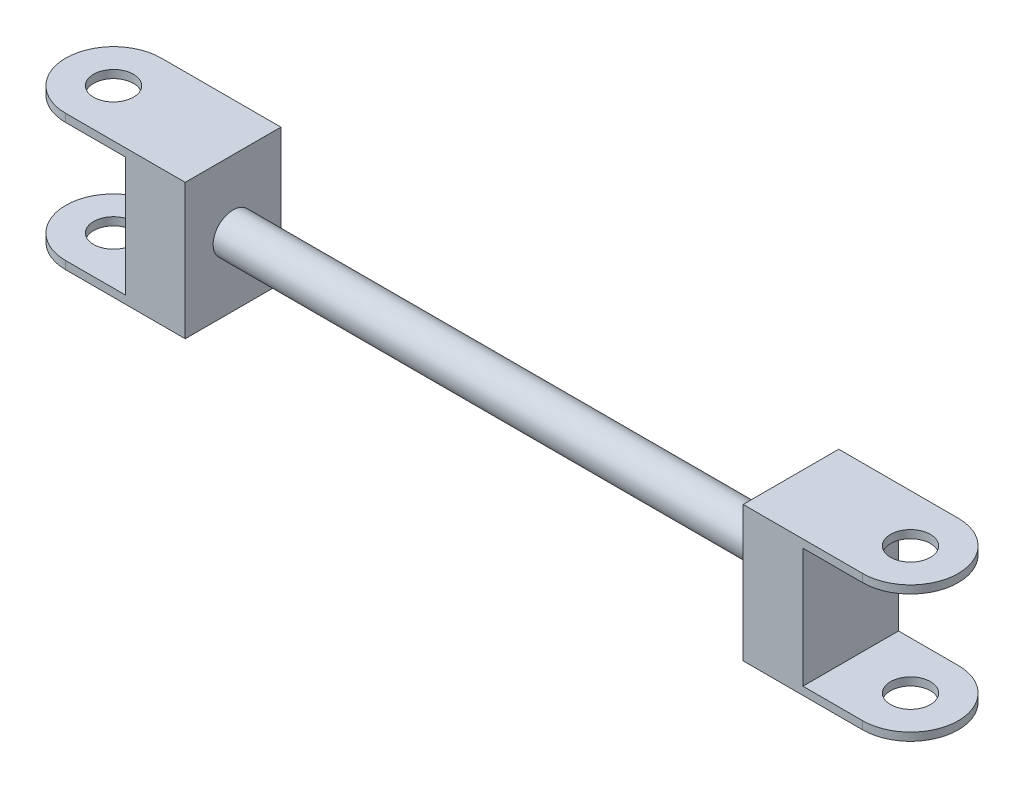
ISO-10303-21;
HEADER;
FILE_DESCRIPTION(('STEP AP214'),'2;1');
FILE_NAME('part.step','',(''),(''),'','','');
FILE_SCHEMA(('AUTOMOTIVE_DESIGN { 1 0 10303 214 1 1 1 1 }'));
ENDSEC;
DATA;
#1=APPLICATION_CONTEXT('core data for automotive mechanical design processes');
#2=APPLICATION_PROTOCOL_DEFINITION('international standard','automotive_design',2000,#1);
#3=PRODUCT_CONTEXT('',#1,'mechanical');
#4=PRODUCT('Part','Part','',(#3));
#5=PRODUCT_RELATED_PRODUCT_CATEGORY('part','',(#4));
#6=PRODUCT_DEFINITION_FORMATION('','',#4);
#7=PRODUCT_DEFINITION_CONTEXT('part definition',#1,'design');
#8=PRODUCT_DEFINITION('design','',#6,#7);
#9=PRODUCT_DEFINITION_SHAPE('','',#8);
#10=(LENGTH_UNIT() NAMED_UNIT(*) SI_UNIT(.MILLI.,.METRE.));
#11=(NAMED_UNIT(*) PLANE_ANGLE_UNIT() SI_UNIT($,.RADIAN.));
#12=(NAMED_UNIT(*) SI_UNIT($,.STERADIAN.) SOLID_ANGLE_UNIT());
#13=UNCERTAINTY_MEASURE_WITH_UNIT(LENGTH_MEASURE(1.E-05),#10,'distance_accuracy_value','');
#14=(GEOMETRIC_REPRESENTATION_CONTEXT(3) GLOBAL_UNCERTAINTY_ASSIGNED_CONTEXT((#13)) GLOBAL_UNIT_ASSIGNED_CONTEXT((#10,
#11,#12)) REPRESENTATION_CONTEXT('',''));
#15=CARTESIAN_POINT('',(0.,0.,0.));
#16=DIRECTION('',(0.,0.,1.));
#17=DIRECTION('',(1.,0.,0.));
#18=AXIS2_PLACEMENT_3D('',#15,#16,#17);
#19=CARTESIAN_POINT('',(-69.176769869488,-17.,0.));
#20=DIRECTION('',(0.,1.,0.));
#21=DIRECTION('',(0.,0.,1.));
#22=AXIS2_PLACEMENT_3D('',#19,#20,#21);
#23=CYLINDRICAL_SURFACE('',#22,12.);
#24=DIRECTION('',(0.,1.,0.));
#25=VECTOR('',#24,1.);
#26=CARTESIAN_POINT('',(-69.176769869488,-17.,12.));
#27=LINE('',#26,#25);
#28=CARTESIAN_POINT('',(-69.176769869488,-17.,12.));
#29=VERTEX_POINT('',#28);
#30=CARTESIAN_POINT('',(-69.176769869488,-15.,12.));
#31=VERTEX_POINT('',#30);
#32=EDGE_CURVE('E102',#29,#31,#27,.T.);
#33=ORIENTED_EDGE('',*,*,#32,.T.);
#34=CARTESIAN_POINT('',(-69.176769869488,-15.,0.));
#35=DIRECTION('',(0.,1.,0.));
#36=DIRECTION('',(0.,0.,1.));
#37=AXIS2_PLACEMENT_3D('',#34,#35,#36);
#38=CIRCLE('',#37,12.);
#39=CARTESIAN_POINT('',(-69.176769869488,-15.,-12.));
#40=VERTEX_POINT('',#39);
#41=EDGE_CURVE('E343',#40,#31,#38,.T.);
#42=ORIENTED_EDGE('',*,*,#41,.F.);
#43=DIRECTION('',(0.,1.,0.));
#44=VECTOR('',#43,1.);
#45=CARTESIAN_POINT('',(-69.176769869488,-17.,-12.));
#46=LINE('',#45,#44);
#47=CARTESIAN_POINT('',(-69.176769869488,-17.,-12.));
#48=VERTEX_POINT('',#47);
#49=EDGE_CURVE('E301',#48,#40,#46,.T.);
#50=ORIENTED_EDGE('',*,*,#49,.F.);
#51=CARTESIAN_POINT('',(-69.176769869488,-17.,0.));
#52=DIRECTION('',(0.,1.,0.));
#53=DIRECTION('',(0.,0.,1.));
#54=AXIS2_PLACEMENT_3D('',#51,#52,#53);
#55=CIRCLE('',#54,12.);
#56=EDGE_CURVE('E294',#48,#29,#55,.T.);
#57=ORIENTED_EDGE('',*,*,#56,.T.);
#58=EDGE_LOOP('',(#33,#42,#50,#57));
#59=FACE_BOUND('',#58,.T.);
#60=ADVANCED_FACE('F93',(#59),#23,.T.);
#61=CARTESIAN_POINT('',(-69.176769869488,-17.,0.));
#62=DIRECTION('',(0.,1.,0.));
#63=DIRECTION('',(0.,0.,1.));
#64=AXIS2_PLACEMENT_3D('',#61,#62,#63);
#65=CYLINDRICAL_SURFACE('',#64,5.);
#66=CARTESIAN_POINT('',(-69.176769869488,-17.,0.));
#67=DIRECTION('',(0.,1.,0.));
#68=DIRECTION('',(0.,0.,1.));
#69=AXIS2_PLACEMENT_3D('',#66,#67,#68);
#70=CIRCLE('',#69,5.);
#71=CARTESIAN_POINT('',(-69.176769869488,-17.,5.));
#72=VERTEX_POINT('',#71);
#73=EDGE_CURVE('E284',#72,#72,#70,.T.);
#74=ORIENTED_EDGE('',*,*,#73,.F.);
#75=EDGE_LOOP('',(#74));
#76=FACE_BOUND('',#75,.T.);
#77=CARTESIAN_POINT('',(-69.176769869488,-15.,0.));
#78=DIRECTION('',(0.,1.,0.));
#79=DIRECTION('',(0.,0.,1.));
#80=AXIS2_PLACEMENT_3D('',#77,#78,#79);
#81=CIRCLE('',#80,5.);
#82=CARTESIAN_POINT('',(-69.176769869488,-15.,5.));
#83=VERTEX_POINT('',#82);
#84=EDGE_CURVE('E313',#83,#83,#81,.F.);
#85=ORIENTED_EDGE('',*,*,#84,.F.);
#86=EDGE_LOOP('',(#85));
#87=FACE_BOUND('',#86,.T.);
#88=ADVANCED_FACE('F391',(#76,#87),#65,.F.);
#89=CARTESIAN_POINT('',(130.823230130512,-17.,0.));
#90=DIRECTION('',(0.,1.,0.));
#91=DIRECTION('',(0.,0.,1.));
#92=AXIS2_PLACEMENT_3D('',#89,#90,#91);
#93=CYLINDRICAL_SURFACE('',#92,12.);
#94=DIRECTION('',(0.,1.,0.));
#95=VECTOR('',#94,1.);
#96=CARTESIAN_POINT('',(130.823230130512,-17.,-12.));
#97=LINE('',#96,#95);
#98=CARTESIAN_POINT('',(130.823230130512,-17.,-12.));
#99=VERTEX_POINT('',#98);
#100=CARTESIAN_POINT('',(130.823230130512,-15.,-12.));
#101=VERTEX_POINT('',#100);
#102=EDGE_CURVE('E222',#99,#101,#97,.T.);
#103=ORIENTED_EDGE('',*,*,#102,.T.);
#104=CARTESIAN_POINT('',(130.823230130512,-15.,0.));
#105=DIRECTION('',(0.,1.,0.));
#106=DIRECTION('',(0.,0.,1.));
#107=AXIS2_PLACEMENT_3D('',#104,#105,#106);
#108=CIRCLE('',#107,12.);
#109=CARTESIAN_POINT('',(130.823230130512,-15.,12.));
#110=VERTEX_POINT('',#109);
#111=EDGE_CURVE('E207',#110,#101,#108,.T.);
#112=ORIENTED_EDGE('',*,*,#111,.F.);
#113=DIRECTION('',(0.,1.,0.));
#114=VECTOR('',#113,1.);
#115=CARTESIAN_POINT('',(130.823230130512,-17.,12.));
#116=LINE('',#115,#114);
#117=CARTESIAN_POINT('',(130.823230130512,-17.,12.));
#118=VERTEX_POINT('',#117);
#119=EDGE_CURVE('E234',#118,#110,#116,.T.);
#120=ORIENTED_EDGE('',*,*,#119,.F.);
#121=CARTESIAN_POINT('',(130.823230130512,-17.,0.));
#122=DIRECTION('',(0.,1.,0.));
#123=DIRECTION('',(0.,0.,1.));
#124=AXIS2_PLACEMENT_3D('',#121,#122,#123);
#125=CIRCLE('',#124,12.);
#126=EDGE_CURVE('E230',#118,#99,#125,.T.);
#127=ORIENTED_EDGE('',*,*,#126,.T.);
#128=EDGE_LOOP('',(#103,#112,#120,#127));
#129=FACE_BOUND('',#128,.T.);
#130=ADVANCED_FACE('F228',(#129),#93,.T.);
#131=CARTESIAN_POINT('',(130.823230130512,-17.,0.));
#132=DIRECTION('',(0.,1.,0.));
#133=DIRECTION('',(0.,0.,1.));
#134=AXIS2_PLACEMENT_3D('',#131,#132,#133);
#135=CYLINDRICAL_SURFACE('',#134,4.99999999999999);
#136=CARTESIAN_POINT('',(130.823230130512,-17.,0.));
#137=DIRECTION('',(0.,1.,0.));
#138=DIRECTION('',(0.,0.,1.));
#139=AXIS2_PLACEMENT_3D('',#136,#137,#138);
#140=CIRCLE('',#139,4.99999999999999);
#141=CARTESIAN_POINT('',(130.823230130512,-17.,4.99999999999999));
#142=VERTEX_POINT('',#141);
#143=EDGE_CURVE('E248',#142,#142,#140,.T.);
#144=ORIENTED_EDGE('',*,*,#143,.F.);
#145=EDGE_LOOP('',(#144));
#146=FACE_BOUND('',#145,.T.);
#147=CARTESIAN_POINT('',(130.823230130512,-15.,0.));
#148=DIRECTION('',(0.,1.,0.));
#149=DIRECTION('',(0.,0.,1.));
#150=AXIS2_PLACEMENT_3D('',#147,#148,#149);
#151=CIRCLE('',#150,4.99999999999999);
#152=CARTESIAN_POINT('',(130.823230130512,-15.,4.99999999999999));
#153=VERTEX_POINT('',#152);
#154=EDGE_CURVE('E308',#153,#153,#151,.F.);
#155=ORIENTED_EDGE('',*,*,#154,.F.);
#156=EDGE_LOOP('',(#155));
#157=FACE_BOUND('',#156,.T.);
#158=ADVANCED_FACE('F412',(#146,#157),#135,.F.);
#159=CARTESIAN_POINT('',(-69.176769869488,-17.,12.));
#160=DIRECTION('',(0.,0.,1.));
#161=DIRECTION('',(1.,0.,0.));
#162=AXIS2_PLACEMENT_3D('',#159,#160,#161);
#163=PLANE('',#162);
#164=DIRECTION('',(1.,0.,0.));
#165=VECTOR('',#164,1.);
#166=CARTESIAN_POINT('',(-69.176769869488,15.,12.));
#167=LINE('',#166,#165);
#168=CARTESIAN_POINT('',(-69.176769869488,15.,12.));
#169=VERTEX_POINT('',#168);
#170=CARTESIAN_POINT('',(-54.176769869488,15.,12.));
#171=VERTEX_POINT('',#170);
#172=EDGE_CURVE('E329',#169,#171,#167,.T.);
#173=ORIENTED_EDGE('',*,*,#172,.T.);
#174=DIRECTION('',(0.,-1.,0.));
#175=VECTOR('',#174,1.);
#176=CARTESIAN_POINT('',(-54.176769869488,15.,12.));
#177=LINE('',#176,#175);
#178=CARTESIAN_POINT('',(-54.176769869488,-15.,12.));
#179=VERTEX_POINT('',#178);
#180=EDGE_CURVE('E326',#171,#179,#177,.T.);
#181=ORIENTED_EDGE('',*,*,#180,.T.);
#182=DIRECTION('',(1.,0.,0.));
#183=VECTOR('',#182,1.);
#184=CARTESIAN_POINT('',(-69.176769869488,-15.,12.));
#185=LINE('',#184,#183);
#186=EDGE_CURVE('E341',#31,#179,#185,.T.);
#187=ORIENTED_EDGE('',*,*,#186,.F.);
#188=ORIENTED_EDGE('',*,*,#32,.F.);
#189=DIRECTION('',(1.,0.,0.));
#190=VECTOR('',#189,1.);
#191=CARTESIAN_POINT('',(-69.176769869488,-17.,12.));
#192=LINE('',#191,#190);
#193=CARTESIAN_POINT('',(-39.176769869488,-17.,12.));
#194=VERTEX_POINT('',#193);
#195=EDGE_CURVE('E287',#29,#194,#192,.T.);
#196=ORIENTED_EDGE('',*,*,#195,.T.);
#197=DIRECTION('',(0.,1.,0.));
#198=VECTOR('',#197,1.);
#199=CARTESIAN_POINT('',(-39.176769869488,-17.,12.));
#200=LINE('',#199,#198);
#201=CARTESIAN_POINT('',(-39.176769869488,17.,12.));
#202=VERTEX_POINT('',#201);
#203=EDGE_CURVE('E297',#194,#202,#200,.T.);
#204=ORIENTED_EDGE('',*,*,#203,.T.);
#205=DIRECTION('',(1.,0.,0.));
#206=VECTOR('',#205,1.);
#207=CARTESIAN_POINT('',(-69.176769869488,17.,12.));
#208=LINE('',#207,#206);
#209=CARTESIAN_POINT('',(-69.176769869488,17.,12.));
#210=VERTEX_POINT('',#209);
#211=EDGE_CURVE('E272',#210,#202,#208,.T.);
#212=ORIENTED_EDGE('',*,*,#211,.F.);
#213=EDGE_CURVE('E300',#169,#210,#27,.T.);
#214=ORIENTED_EDGE('',*,*,#213,.F.);
#215=EDGE_LOOP('',(#173,#181,#187,#188,#196,#204,#212,#214));
#216=FACE_BOUND('',#215,.T.);
#217=ADVANCED_FACE('F95',(#216),#163,.T.);
#218=CARTESIAN_POINT('',(-69.176769869488,15.,0.));
#219=DIRECTION('',(0.,1.,0.));
#220=DIRECTION('',(0.,0.,1.));
#221=AXIS2_PLACEMENT_3D('',#218,#219,#220);
#222=CIRCLE('',#221,12.);
#223=CARTESIAN_POINT('',(-69.176769869488,15.,-12.));
#224=VERTEX_POINT('',#223);
#225=EDGE_CURVE('E332',#224,#169,#222,.T.);
#226=ORIENTED_EDGE('',*,*,#225,.T.);
#227=ORIENTED_EDGE('',*,*,#213,.T.);
#228=CARTESIAN_POINT('',(-69.176769869488,17.,0.));
#229=DIRECTION('',(0.,1.,0.));
#230=DIRECTION('',(0.,0.,1.));
#231=AXIS2_PLACEMENT_3D('',#228,#229,#230);
#232=CIRCLE('',#231,12.);
#233=CARTESIAN_POINT('',(-69.176769869488,17.,-12.));
#234=VERTEX_POINT('',#233);
#235=EDGE_CURVE('E281',#234,#210,#232,.T.);
#236=ORIENTED_EDGE('',*,*,#235,.F.);
#237=EDGE_CURVE('E304',#224,#234,#46,.T.);
#238=ORIENTED_EDGE('',*,*,#237,.F.);
#239=EDGE_LOOP('',(#226,#227,#236,#238));
#240=FACE_BOUND('',#239,.T.);
#241=ADVANCED_FACE('F394',(#240),#23,.T.);
#242=CARTESIAN_POINT('',(-69.176769869488,-17.,-12.));
#243=DIRECTION('',(0.,0.,1.));
#244=DIRECTION('',(1.,0.,0.));
#245=AXIS2_PLACEMENT_3D('',#242,#243,#244);
#246=PLANE('',#245);
#247=DIRECTION('',(0.,-1.,0.));
#248=VECTOR('',#247,1.);
#249=CARTESIAN_POINT('',(-54.176769869488,15.,-12.));
#250=LINE('',#249,#248);
#251=CARTESIAN_POINT('',(-54.176769869488,15.,-12.));
#252=VERTEX_POINT('',#251);
#253=CARTESIAN_POINT('',(-54.176769869488,-15.,-12.));
#254=VERTEX_POINT('',#253);
#255=EDGE_CURVE('E216',#252,#254,#250,.T.);
#256=ORIENTED_EDGE('',*,*,#255,.F.);
#257=DIRECTION('',(-1.,0.,0.));
#258=VECTOR('',#257,1.);
#259=CARTESIAN_POINT('',(-54.176769869488,15.,-12.));
#260=LINE('',#259,#258);
#261=EDGE_CURVE('E335',#252,#224,#260,.T.);
#262=ORIENTED_EDGE('',*,*,#261,.T.);
#263=ORIENTED_EDGE('',*,*,#237,.T.);
#264=DIRECTION('',(1.,0.,0.));
#265=VECTOR('',#264,1.);
#266=CARTESIAN_POINT('',(-69.176769869488,17.,-12.));
#267=LINE('',#266,#265);
#268=CARTESIAN_POINT('',(-39.176769869488,17.,-12.));
#269=VERTEX_POINT('',#268);
#270=EDGE_CURVE('E278',#234,#269,#267,.T.);
#271=ORIENTED_EDGE('',*,*,#270,.T.);
#272=DIRECTION('',(0.,1.,0.));
#273=VECTOR('',#272,1.);
#274=CARTESIAN_POINT('',(-39.176769869488,-17.,-12.));
#275=LINE('',#274,#273);
#276=CARTESIAN_POINT('',(-39.176769869488,-17.,-12.));
#277=VERTEX_POINT('',#276);
#278=EDGE_CURVE('E305',#277,#269,#275,.T.);
#279=ORIENTED_EDGE('',*,*,#278,.F.);
#280=DIRECTION('',(1.,0.,0.));
#281=VECTOR('',#280,1.);
#282=CARTESIAN_POINT('',(-69.176769869488,-17.,-12.));
#283=LINE('',#282,#281);
#284=EDGE_CURVE('E292',#48,#277,#283,.T.);
#285=ORIENTED_EDGE('',*,*,#284,.F.);
#286=ORIENTED_EDGE('',*,*,#49,.T.);
#287=DIRECTION('',(-1.,0.,0.));
#288=VECTOR('',#287,1.);
#289=CARTESIAN_POINT('',(-54.176769869488,-15.,-12.));
#290=LINE('',#289,#288);
#291=EDGE_CURVE('E345',#254,#40,#290,.T.);
#292=ORIENTED_EDGE('',*,*,#291,.F.);
#293=EDGE_LOOP('',(#256,#262,#263,#271,#279,#285,#286,#292));
#294=FACE_BOUND('',#293,.T.);
#295=ADVANCED_FACE('F404',(#294),#246,.F.);
#296=CARTESIAN_POINT('',(-39.176769869488,-17.,-12.));
#297=DIRECTION('',(-1.,0.,0.));
#298=DIRECTION('',(0.,0.,1.));
#299=AXIS2_PLACEMENT_3D('',#296,#297,#298);
#300=PLANE('',#299);
#301=CARTESIAN_POINT('',(-39.176769869488,0.,0.));
#302=DIRECTION('',(1.,0.,0.));
#303=DIRECTION('',(0.,0.,-1.));
#304=AXIS2_PLACEMENT_3D('',#301,#302,#303);
#305=CIRCLE('',#304,5.);
#306=CARTESIAN_POINT('',(-39.176769869488,0.,-5.));
#307=VERTEX_POINT('',#306);
#308=EDGE_CURVE('E12',#307,#307,#305,.T.);
#309=ORIENTED_EDGE('',*,*,#308,.F.);
#310=EDGE_LOOP('',(#309));
#311=FACE_BOUND('',#310,.T.);
#312=ORIENTED_EDGE('',*,*,#278,.T.);
#313=DIRECTION('',(0.,0.,1.));
#314=VECTOR('',#313,1.);
#315=CARTESIAN_POINT('',(-39.176769869488,17.,-12.));
#316=LINE('',#315,#314);
#317=EDGE_CURVE('E275',#269,#202,#316,.T.);
#318=ORIENTED_EDGE('',*,*,#317,.T.);
#319=ORIENTED_EDGE('',*,*,#203,.F.);
#320=DIRECTION('',(0.,0.,1.));
#321=VECTOR('',#320,1.);
#322=CARTESIAN_POINT('',(-39.176769869488,-17.,-12.));
#323=LINE('',#322,#321);
#324=EDGE_CURVE('E290',#277,#194,#323,.T.);
#325=ORIENTED_EDGE('',*,*,#324,.F.);
#326=EDGE_LOOP('',(#312,#318,#319,#325));
#327=FACE_BOUND('',#326,.T.);
#328=ADVANCED_FACE('F410',(#311,#327),#300,.F.);
#329=CARTESIAN_POINT('',(-69.176769869488,-17.,0.));
#330=DIRECTION('',(0.,1.,0.));
#331=DIRECTION('',(0.,0.,1.));
#332=AXIS2_PLACEMENT_3D('',#329,#330,#331);
#333=PLANE('',#332);
#334=ORIENTED_EDGE('',*,*,#73,.T.);
#335=EDGE_LOOP('',(#334));
#336=FACE_BOUND('',#335,.T.);
#337=ORIENTED_EDGE('',*,*,#195,.F.);
#338=ORIENTED_EDGE('',*,*,#56,.F.);
#339=ORIENTED_EDGE('',*,*,#284,.T.);
#340=ORIENTED_EDGE('',*,*,#324,.T.);
#341=EDGE_LOOP('',(#337,#338,#339,#340));
#342=FACE_BOUND('',#341,.T.);
#343=ADVANCED_FACE('F441',(#336,#342),#333,.F.);
#344=CARTESIAN_POINT('',(-69.176769869488,15.,0.));
#345=DIRECTION('',(0.,1.,0.));
#346=DIRECTION('',(0.,0.,1.));
#347=AXIS2_PLACEMENT_3D('',#344,#345,#346);
#348=CIRCLE('',#347,5.);
#349=CARTESIAN_POINT('',(-69.176769869488,15.,5.));
#350=VERTEX_POINT('',#349);
#351=EDGE_CURVE('E97',#350,#350,#348,.F.);
#352=ORIENTED_EDGE('',*,*,#351,.T.);
#353=EDGE_LOOP('',(#352));
#354=FACE_BOUND('',#353,.T.);
#355=CARTESIAN_POINT('',(-69.176769869488,17.,0.));
#356=DIRECTION('',(0.,1.,0.));
#357=DIRECTION('',(0.,0.,1.));
#358=AXIS2_PLACEMENT_3D('',#355,#356,#357);
#359=CIRCLE('',#358,5.);
#360=CARTESIAN_POINT('',(-69.176769869488,17.,5.));
#361=VERTEX_POINT('',#360);
#362=EDGE_CURVE('E269',#361,#361,#359,.T.);
#363=ORIENTED_EDGE('',*,*,#362,.T.);
#364=EDGE_LOOP('',(#363));
#365=FACE_BOUND('',#364,.T.);
#366=ADVANCED_FACE('F400',(#354,#365),#65,.F.);
#367=CARTESIAN_POINT('',(-69.176769869488,17.,0.));
#368=DIRECTION('',(0.,1.,0.));
#369=DIRECTION('',(0.,0.,1.));
#370=AXIS2_PLACEMENT_3D('',#367,#368,#369);
#371=PLANE('',#370);
#372=ORIENTED_EDGE('',*,*,#211,.T.);
#373=ORIENTED_EDGE('',*,*,#317,.F.);
#374=ORIENTED_EDGE('',*,*,#270,.F.);
#375=ORIENTED_EDGE('',*,*,#235,.T.);
#376=EDGE_LOOP('',(#372,#373,#374,#375));
#377=FACE_BOUND('',#376,.T.);
#378=ORIENTED_EDGE('',*,*,#362,.F.);
#379=EDGE_LOOP('',(#378));
#380=FACE_BOUND('',#379,.T.);
#381=ADVANCED_FACE('F422',(#377,#380),#371,.T.);
#382=CARTESIAN_POINT('',(114.965365754243,0.,0.));
#383=DIRECTION('',(-1.,0.,0.));
#384=DIRECTION('',(0.,0.,1.));
#385=AXIS2_PLACEMENT_3D('',#382,#383,#384);
#386=CYLINDRICAL_SURFACE('',#385,5.);
#387=CARTESIAN_POINT('',(100.823230130512,0.,0.));
#388=DIRECTION('',(-1.,0.,0.));
#389=DIRECTION('',(0.,0.,1.));
#390=AXIS2_PLACEMENT_3D('',#387,#388,#389);
#391=CIRCLE('',#390,5.);
#392=CARTESIAN_POINT('',(100.823230130512,0.,5.));
#393=VERTEX_POINT('',#392);
#394=EDGE_CURVE('E265',#393,#393,#391,.T.);
#395=ORIENTED_EDGE('',*,*,#394,.T.);
#396=EDGE_LOOP('',(#395));
#397=FACE_BOUND('',#396,.T.);
#398=ORIENTED_EDGE('',*,*,#308,.T.);
#399=EDGE_LOOP('',(#398));
#400=FACE_BOUND('',#399,.T.);
#401=ADVANCED_FACE('F387',(#397,#400),#386,.T.);
#402=CARTESIAN_POINT('',(130.823230130512,-17.,12.));
#403=DIRECTION('',(0.,0.,-1.));
#404=DIRECTION('',(-1.,0.,0.));
#405=AXIS2_PLACEMENT_3D('',#402,#403,#404);
#406=PLANE('',#405);
#407=DIRECTION('',(0.,-1.,0.));
#408=VECTOR('',#407,1.);
#409=CARTESIAN_POINT('',(115.823230130512,15.,12.));
#410=LINE('',#409,#408);
#411=CARTESIAN_POINT('',(115.823230130512,15.,12.));
#412=VERTEX_POINT('',#411);
#413=CARTESIAN_POINT('',(115.823230130512,-15.,12.));
#414=VERTEX_POINT('',#413);
#415=EDGE_CURVE('E349',#412,#414,#410,.T.);
#416=ORIENTED_EDGE('',*,*,#415,.F.);
#417=DIRECTION('',(1.,0.,0.));
#418=VECTOR('',#417,1.);
#419=CARTESIAN_POINT('',(115.823230130512,15.,12.));
#420=LINE('',#419,#418);
#421=CARTESIAN_POINT('',(130.823230130512,15.,12.));
#422=VERTEX_POINT('',#421);
#423=EDGE_CURVE('E351',#412,#422,#420,.T.);
#424=ORIENTED_EDGE('',*,*,#423,.T.);
#425=CARTESIAN_POINT('',(130.823230130512,17.,12.));
#426=VERTEX_POINT('',#425);
#427=EDGE_CURVE('E231',#422,#426,#116,.T.);
#428=ORIENTED_EDGE('',*,*,#427,.T.);
#429=DIRECTION('',(-1.,0.,0.));
#430=VECTOR('',#429,1.);
#431=CARTESIAN_POINT('',(130.823230130512,17.,12.));
#432=LINE('',#431,#430);
#433=CARTESIAN_POINT('',(100.823230130512,17.,12.));
#434=VERTEX_POINT('',#433);
#435=EDGE_CURVE('E260',#426,#434,#432,.T.);
#436=ORIENTED_EDGE('',*,*,#435,.T.);
#437=DIRECTION('',(0.,1.,0.));
#438=VECTOR('',#437,1.);
#439=CARTESIAN_POINT('',(100.823230130512,-17.,12.));
#440=LINE('',#439,#438);
#441=CARTESIAN_POINT('',(100.823230130512,-17.,12.));
#442=VERTEX_POINT('',#441);
#443=EDGE_CURVE('E318',#442,#434,#440,.T.);
#444=ORIENTED_EDGE('',*,*,#443,.F.);
#445=DIRECTION('',(-1.,0.,0.));
#446=VECTOR('',#445,1.);
#447=CARTESIAN_POINT('',(130.823230130512,-17.,12.));
#448=LINE('',#447,#446);
#449=EDGE_CURVE('E246',#118,#442,#448,.T.);
#450=ORIENTED_EDGE('',*,*,#449,.F.);
#451=ORIENTED_EDGE('',*,*,#119,.T.);
#452=DIRECTION('',(1.,0.,0.));
#453=VECTOR('',#452,1.);
#454=CARTESIAN_POINT('',(115.823230130512,-15.,12.));
#455=LINE('',#454,#453);
#456=EDGE_CURVE('E118',#414,#110,#455,.T.);
#457=ORIENTED_EDGE('',*,*,#456,.F.);
#458=EDGE_LOOP('',(#416,#424,#428,#436,#444,#450,#451,#457));
#459=FACE_BOUND('',#458,.T.);
#460=ADVANCED_FACE('F365',(#459),#406,.F.);
#461=CARTESIAN_POINT('',(100.823230130512,-17.,-12.));
#462=DIRECTION('',(-1.,0.,0.));
#463=DIRECTION('',(0.,0.,1.));
#464=AXIS2_PLACEMENT_3D('',#461,#462,#463);
#465=PLANE('',#464);
#466=ORIENTED_EDGE('',*,*,#394,.F.);
#467=EDGE_LOOP('',(#466));
#468=FACE_BOUND('',#467,.T.);
#469=ORIENTED_EDGE('',*,*,#443,.T.);
#470=DIRECTION('',(0.,0.,1.));
#471=VECTOR('',#470,1.);
#472=CARTESIAN_POINT('',(100.823230130512,17.,-12.));
#473=LINE('',#472,#471);
#474=CARTESIAN_POINT('',(100.823230130512,17.,-12.));
#475=VERTEX_POINT('',#474);
#476=EDGE_CURVE('E257',#475,#434,#473,.T.);
#477=ORIENTED_EDGE('',*,*,#476,.F.);
#478=DIRECTION('',(0.,1.,0.));
#479=VECTOR('',#478,1.);
#480=CARTESIAN_POINT('',(100.823230130512,-17.,-12.));
#481=LINE('',#480,#479);
#482=CARTESIAN_POINT('',(100.823230130512,-17.,-12.));
#483=VERTEX_POINT('',#482);
#484=EDGE_CURVE('E236',#483,#475,#481,.T.);
#485=ORIENTED_EDGE('',*,*,#484,.F.);
#486=DIRECTION('',(0.,0.,1.));
#487=VECTOR('',#486,1.);
#488=CARTESIAN_POINT('',(100.823230130512,-17.,-12.));
#489=LINE('',#488,#487);
#490=EDGE_CURVE('E243',#483,#442,#489,.T.);
#491=ORIENTED_EDGE('',*,*,#490,.T.);
#492=EDGE_LOOP('',(#469,#477,#485,#491));
#493=FACE_BOUND('',#492,.T.);
#494=ADVANCED_FACE('F377',(#468,#493),#465,.T.);
#495=CARTESIAN_POINT('',(130.823230130512,-17.,-12.));
#496=DIRECTION('',(0.,0.,-1.));
#497=DIRECTION('',(-1.,0.,0.));
#498=AXIS2_PLACEMENT_3D('',#495,#496,#497);
#499=PLANE('',#498);
#500=DIRECTION('',(-1.,0.,0.));
#501=VECTOR('',#500,1.);
#502=CARTESIAN_POINT('',(130.823230130512,15.,-12.));
#503=LINE('',#502,#501);
#504=CARTESIAN_POINT('',(130.823230130512,15.,-12.));
#505=VERTEX_POINT('',#504);
#506=CARTESIAN_POINT('',(115.823230130512,15.,-12.));
#507=VERTEX_POINT('',#506);
#508=EDGE_CURVE('E356',#505,#507,#503,.T.);
#509=ORIENTED_EDGE('',*,*,#508,.T.);
#510=DIRECTION('',(0.,-1.,0.));
#511=VECTOR('',#510,1.);
#512=CARTESIAN_POINT('',(115.823230130512,15.,-12.));
#513=LINE('',#512,#511);
#514=CARTESIAN_POINT('',(115.823230130512,-15.,-12.));
#515=VERTEX_POINT('',#514);
#516=EDGE_CURVE('E224',#507,#515,#513,.T.);
#517=ORIENTED_EDGE('',*,*,#516,.T.);
#518=DIRECTION('',(-1.,0.,0.));
#519=VECTOR('',#518,1.);
#520=CARTESIAN_POINT('',(130.823230130512,-15.,-12.));
#521=LINE('',#520,#519);
#522=EDGE_CURVE('E211',#101,#515,#521,.T.);
#523=ORIENTED_EDGE('',*,*,#522,.F.);
#524=ORIENTED_EDGE('',*,*,#102,.F.);
#525=DIRECTION('',(-1.,0.,0.));
#526=VECTOR('',#525,1.);
#527=CARTESIAN_POINT('',(130.823230130512,-17.,-12.));
#528=LINE('',#527,#526);
#529=EDGE_CURVE('E241',#99,#483,#528,.T.);
#530=ORIENTED_EDGE('',*,*,#529,.T.);
#531=ORIENTED_EDGE('',*,*,#484,.T.);
#532=DIRECTION('',(-1.,0.,0.));
#533=VECTOR('',#532,1.);
#534=CARTESIAN_POINT('',(130.823230130512,17.,-12.));
#535=LINE('',#534,#533);
#536=CARTESIAN_POINT('',(130.823230130512,17.,-12.));
#537=VERTEX_POINT('',#536);
#538=EDGE_CURVE('E254',#537,#475,#535,.T.);
#539=ORIENTED_EDGE('',*,*,#538,.F.);
#540=EDGE_CURVE('E232',#505,#537,#97,.T.);
#541=ORIENTED_EDGE('',*,*,#540,.F.);
#542=EDGE_LOOP('',(#509,#517,#523,#524,#530,#531,#539,#541));
#543=FACE_BOUND('',#542,.T.);
#544=ADVANCED_FACE('F220',(#543),#499,.T.);
#545=CARTESIAN_POINT('',(130.823230130512,15.,0.));
#546=DIRECTION('',(0.,1.,0.));
#547=DIRECTION('',(0.,0.,1.));
#548=AXIS2_PLACEMENT_3D('',#545,#546,#547);
#549=CIRCLE('',#548,12.);
#550=EDGE_CURVE('E358',#422,#505,#549,.T.);
#551=ORIENTED_EDGE('',*,*,#550,.T.);
#552=ORIENTED_EDGE('',*,*,#540,.T.);
#553=CARTESIAN_POINT('',(130.823230130512,17.,0.));
#554=DIRECTION('',(0.,1.,0.));
#555=DIRECTION('',(0.,0.,1.));
#556=AXIS2_PLACEMENT_3D('',#553,#554,#555);
#557=CIRCLE('',#556,12.);
#558=EDGE_CURVE('E251',#426,#537,#557,.T.);
#559=ORIENTED_EDGE('',*,*,#558,.F.);
#560=ORIENTED_EDGE('',*,*,#427,.F.);
#561=EDGE_LOOP('',(#551,#552,#559,#560));
#562=FACE_BOUND('',#561,.T.);
#563=ADVANCED_FACE('F385',(#562),#93,.T.);
#564=CARTESIAN_POINT('',(130.823230130512,-17.,0.));
#565=DIRECTION('',(0.,1.,0.));
#566=DIRECTION('',(0.,0.,1.));
#567=AXIS2_PLACEMENT_3D('',#564,#565,#566);
#568=PLANE('',#567);
#569=ORIENTED_EDGE('',*,*,#143,.T.);
#570=EDGE_LOOP('',(#569));
#571=FACE_BOUND('',#570,.T.);
#572=ORIENTED_EDGE('',*,*,#449,.T.);
#573=ORIENTED_EDGE('',*,*,#490,.F.);
#574=ORIENTED_EDGE('',*,*,#529,.F.);
#575=ORIENTED_EDGE('',*,*,#126,.F.);
#576=EDGE_LOOP('',(#572,#573,#574,#575));
#577=FACE_BOUND('',#576,.T.);
#578=ADVANCED_FACE('F369',(#571,#577),#568,.F.);
#579=CARTESIAN_POINT('',(130.823230130512,15.,0.));
#580=DIRECTION('',(0.,1.,0.));
#581=DIRECTION('',(0.,0.,1.));
#582=AXIS2_PLACEMENT_3D('',#579,#580,#581);
#583=CIRCLE('',#582,4.99999999999999);
#584=CARTESIAN_POINT('',(130.823230130512,15.,4.99999999999999));
#585=VERTEX_POINT('',#584);
#586=EDGE_CURVE('E311',#585,#585,#583,.F.);
#587=ORIENTED_EDGE('',*,*,#586,.T.);
#588=EDGE_LOOP('',(#587));
#589=FACE_BOUND('',#588,.T.);
#590=CARTESIAN_POINT('',(130.823230130512,17.,0.));
#591=DIRECTION('',(0.,1.,0.));
#592=DIRECTION('',(0.,0.,1.));
#593=AXIS2_PLACEMENT_3D('',#590,#591,#592);
#594=CIRCLE('',#593,4.99999999999999);
#595=CARTESIAN_POINT('',(130.823230130512,17.,4.99999999999999));
#596=VERTEX_POINT('',#595);
#597=EDGE_CURVE('E263',#596,#596,#594,.T.);
#598=ORIENTED_EDGE('',*,*,#597,.T.);
#599=EDGE_LOOP('',(#598));
#600=FACE_BOUND('',#599,.T.);
#601=ADVANCED_FACE('F458',(#589,#600),#135,.F.);
#602=CARTESIAN_POINT('',(130.823230130512,17.,0.));
#603=DIRECTION('',(0.,1.,0.));
#604=DIRECTION('',(0.,0.,1.));
#605=AXIS2_PLACEMENT_3D('',#602,#603,#604);
#606=PLANE('',#605);
#607=ORIENTED_EDGE('',*,*,#435,.F.);
#608=ORIENTED_EDGE('',*,*,#558,.T.);
#609=ORIENTED_EDGE('',*,*,#538,.T.);
#610=ORIENTED_EDGE('',*,*,#476,.T.);
#611=EDGE_LOOP('',(#607,#608,#609,#610));
#612=FACE_BOUND('',#611,.T.);
#613=ORIENTED_EDGE('',*,*,#597,.F.);
#614=EDGE_LOOP('',(#613));
#615=FACE_BOUND('',#614,.T.);
#616=ADVANCED_FACE('F374',(#612,#615),#606,.T.);
#617=CARTESIAN_POINT('',(130.823230130512,15.,0.));
#618=DIRECTION('',(0.,1.,0.));
#619=DIRECTION('',(0.,0.,1.));
#620=AXIS2_PLACEMENT_3D('',#617,#618,#619);
#621=PLANE('',#620);
#622=ORIENTED_EDGE('',*,*,#550,.F.);
#623=ORIENTED_EDGE('',*,*,#423,.F.);
#624=DIRECTION('',(0.,0.,1.));
#625=VECTOR('',#624,1.);
#626=CARTESIAN_POINT('',(115.823230130512,15.,-12.));
#627=LINE('',#626,#625);
#628=EDGE_CURVE('E354',#507,#412,#627,.T.);
#629=ORIENTED_EDGE('',*,*,#628,.F.);
#630=ORIENTED_EDGE('',*,*,#508,.F.);
#631=EDGE_LOOP('',(#622,#623,#629,#630));
#632=FACE_BOUND('',#631,.T.);
#633=ORIENTED_EDGE('',*,*,#586,.F.);
#634=EDGE_LOOP('',(#633));
#635=FACE_BOUND('',#634,.T.);
#636=ADVANCED_FACE('F457',(#632,#635),#621,.F.);
#637=CARTESIAN_POINT('',(130.823230130512,-15.,0.));
#638=DIRECTION('',(0.,1.,0.));
#639=DIRECTION('',(0.,0.,1.));
#640=AXIS2_PLACEMENT_3D('',#637,#638,#639);
#641=PLANE('',#640);
#642=ORIENTED_EDGE('',*,*,#111,.T.);
#643=ORIENTED_EDGE('',*,*,#522,.T.);
#644=DIRECTION('',(0.,0.,1.));
#645=VECTOR('',#644,1.);
#646=CARTESIAN_POINT('',(115.823230130512,-15.,-12.));
#647=LINE('',#646,#645);
#648=EDGE_CURVE('E225',#515,#414,#647,.T.);
#649=ORIENTED_EDGE('',*,*,#648,.T.);
#650=ORIENTED_EDGE('',*,*,#456,.T.);
#651=EDGE_LOOP('',(#642,#643,#649,#650));
#652=FACE_BOUND('',#651,.T.);
#653=ORIENTED_EDGE('',*,*,#154,.T.);
#654=EDGE_LOOP('',(#653));
#655=FACE_BOUND('',#654,.T.);
#656=ADVANCED_FACE('F209',(#652,#655),#641,.T.);
#657=CARTESIAN_POINT('',(115.823230130512,15.,-12.));
#658=DIRECTION('',(1.,0.,0.));
#659=DIRECTION('',(0.,0.,-1.));
#660=AXIS2_PLACEMENT_3D('',#657,#658,#659);
#661=PLANE('',#660);
#662=ORIENTED_EDGE('',*,*,#516,.F.);
#663=ORIENTED_EDGE('',*,*,#628,.T.);
#664=ORIENTED_EDGE('',*,*,#415,.T.);
#665=ORIENTED_EDGE('',*,*,#648,.F.);
#666=EDGE_LOOP('',(#662,#663,#664,#665));
#667=FACE_BOUND('',#666,.T.);
#668=ADVANCED_FACE('F480',(#667),#661,.T.);
#669=CARTESIAN_POINT('',(-69.176769869488,15.,0.));
#670=DIRECTION('',(0.,1.,0.));
#671=DIRECTION('',(0.,0.,1.));
#672=AXIS2_PLACEMENT_3D('',#669,#670,#671);
#673=PLANE('',#672);
#674=DIRECTION('',(0.,0.,-1.));
#675=VECTOR('',#674,1.);
#676=CARTESIAN_POINT('',(-54.176769869488,15.,-12.));
#677=LINE('',#676,#675);
#678=EDGE_CURVE('E338',#171,#252,#677,.T.);
#679=ORIENTED_EDGE('',*,*,#678,.F.);
#680=ORIENTED_EDGE('',*,*,#172,.F.);
#681=ORIENTED_EDGE('',*,*,#225,.F.);
#682=ORIENTED_EDGE('',*,*,#261,.F.);
#683=EDGE_LOOP('',(#679,#680,#681,#682));
#684=FACE_BOUND('',#683,.T.);
#685=ORIENTED_EDGE('',*,*,#351,.F.);
#686=EDGE_LOOP('',(#685));
#687=FACE_BOUND('',#686,.T.);
#688=ADVANCED_FACE('F433',(#684,#687),#673,.F.);
#689=CARTESIAN_POINT('',(-69.176769869488,-15.,0.));
#690=DIRECTION('',(0.,1.,0.));
#691=DIRECTION('',(0.,0.,1.));
#692=AXIS2_PLACEMENT_3D('',#689,#690,#691);
#693=PLANE('',#692);
#694=DIRECTION('',(0.,0.,-1.));
#695=VECTOR('',#694,1.);
#696=CARTESIAN_POINT('',(-54.176769869488,-15.,-12.));
#697=LINE('',#696,#695);
#698=EDGE_CURVE('E110',#179,#254,#697,.T.);
#699=ORIENTED_EDGE('',*,*,#698,.T.);
#700=ORIENTED_EDGE('',*,*,#291,.T.);
#701=ORIENTED_EDGE('',*,*,#41,.T.);
#702=ORIENTED_EDGE('',*,*,#186,.T.);
#703=EDGE_LOOP('',(#699,#700,#701,#702));
#704=FACE_BOUND('',#703,.T.);
#705=ORIENTED_EDGE('',*,*,#84,.T.);
#706=EDGE_LOOP('',(#705));
#707=FACE_BOUND('',#706,.T.);
#708=ADVANCED_FACE('F490',(#704,#707),#693,.T.);
#709=CARTESIAN_POINT('',(-54.176769869488,15.,-12.));
#710=DIRECTION('',(-1.,0.,0.));
#711=DIRECTION('',(0.,0.,1.));
#712=AXIS2_PLACEMENT_3D('',#709,#710,#711);
#713=PLANE('',#712);
#714=ORIENTED_EDGE('',*,*,#180,.F.);
#715=ORIENTED_EDGE('',*,*,#678,.T.);
#716=ORIENTED_EDGE('',*,*,#255,.T.);
#717=ORIENTED_EDGE('',*,*,#698,.F.);
#718=EDGE_LOOP('',(#714,#715,#716,#717));
#719=FACE_BOUND('',#718,.T.);
#720=ADVANCED_FACE('F436',(#719),#713,.T.);
#721=CLOSED_SHELL('',(#60,#88,#130,#158,#217,#241,#295,#328,#343,#366,#381,#401,#460,#494,#544,
#563,#578,#601,#616,#636,#656,#668,#688,#708,#720));
#722=MANIFOLD_SOLID_BREP('B2',#721);
#723=ADVANCED_BREP_SHAPE_REPRESENTATION('',(#18,#722),#14);
#724=SHAPE_DEFINITION_REPRESENTATION(#9,#723);
ENDSEC;
END-ISO-10303-21;
